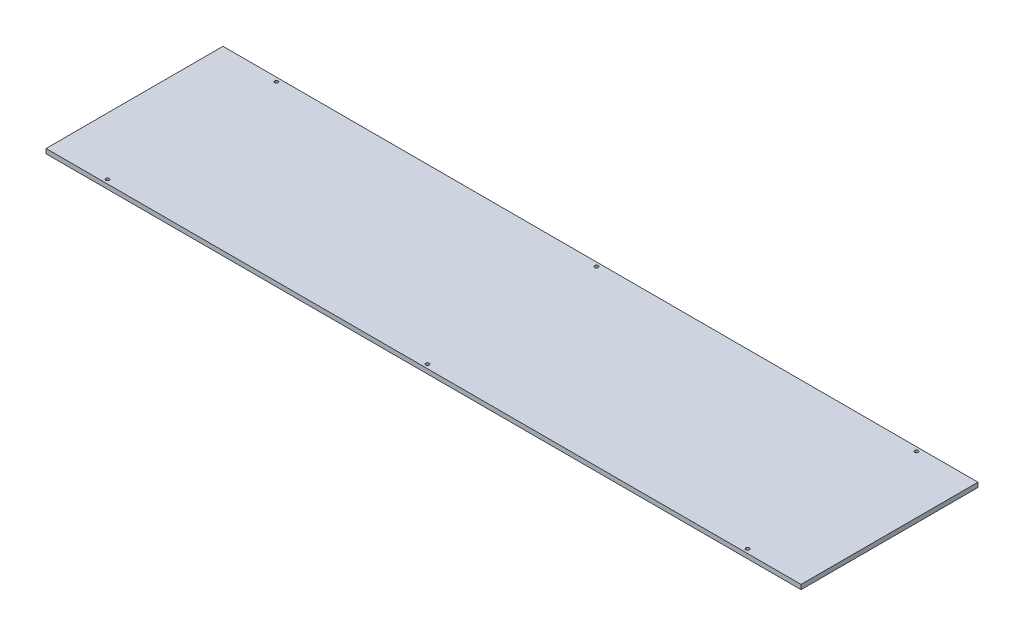
ISO-10303-21;
HEADER;
FILE_DESCRIPTION(('STEP AP214'),'2;1');
FILE_NAME('part.step','',(''),(''),'','','');
FILE_SCHEMA(('AUTOMOTIVE_DESIGN { 1 0 10303 214 1 1 1 1 }'));
ENDSEC;
DATA;
#1=APPLICATION_CONTEXT('core data for automotive mechanical design processes');
#2=APPLICATION_PROTOCOL_DEFINITION('international standard','automotive_design',2000,#1);
#3=PRODUCT_CONTEXT('',#1,'mechanical');
#4=PRODUCT('Part','Part','',(#3));
#5=PRODUCT_RELATED_PRODUCT_CATEGORY('part','',(#4));
#6=PRODUCT_DEFINITION_FORMATION('','',#4);
#7=PRODUCT_DEFINITION_CONTEXT('part definition',#1,'design');
#8=PRODUCT_DEFINITION('design','',#6,#7);
#9=PRODUCT_DEFINITION_SHAPE('','',#8);
#10=(LENGTH_UNIT() NAMED_UNIT(*) SI_UNIT(.MILLI.,.METRE.));
#11=(NAMED_UNIT(*) PLANE_ANGLE_UNIT() SI_UNIT($,.RADIAN.));
#12=(NAMED_UNIT(*) SI_UNIT($,.STERADIAN.) SOLID_ANGLE_UNIT());
#13=UNCERTAINTY_MEASURE_WITH_UNIT(LENGTH_MEASURE(1.E-05),#10,'distance_accuracy_value','');
#14=(GEOMETRIC_REPRESENTATION_CONTEXT(3) GLOBAL_UNCERTAINTY_ASSIGNED_CONTEXT((#13)) GLOBAL_UNIT_ASSIGNED_CONTEXT((#10,
#11,#12)) REPRESENTATION_CONTEXT('',''));
#15=CARTESIAN_POINT('',(0.,0.,0.));
#16=DIRECTION('',(0.,0.,1.));
#17=DIRECTION('',(1.,0.,0.));
#18=AXIS2_PLACEMENT_3D('',#15,#16,#17);
#19=CARTESIAN_POINT('',(0.,4.,0.));
#20=DIRECTION('',(0.,-1.,0.));
#21=DIRECTION('',(0.,0.,-1.));
#22=AXIS2_PLACEMENT_3D('',#19,#20,#21);
#23=PLANE('',#22);
#24=DIRECTION('',(0.,0.,1.));
#25=VECTOR('',#24,1.);
#26=CARTESIAN_POINT('',(-306.746461538461,4.,74.1935384615384));
#27=LINE('',#26,#25);
#28=CARTESIAN_POINT('',(-306.746461538461,4.,-79.8064615384616));
#29=VERTEX_POINT('',#28);
#30=CARTESIAN_POINT('',(-306.746461538461,4.,74.1935384615384));
#31=VERTEX_POINT('',#30);
#32=EDGE_CURVE('E89',#29,#31,#27,.T.);
#33=ORIENTED_EDGE('',*,*,#32,.T.);
#34=DIRECTION('',(1.,0.,0.));
#35=VECTOR('',#34,1.);
#36=CARTESIAN_POINT('',(-306.746461538461,4.,74.1935384615384));
#37=LINE('',#36,#35);
#38=CARTESIAN_POINT('',(350.253538461539,4.,74.1935384615384));
#39=VERTEX_POINT('',#38);
#40=EDGE_CURVE('E84',#31,#39,#37,.T.);
#41=ORIENTED_EDGE('',*,*,#40,.T.);
#42=DIRECTION('',(0.,0.,-1.));
#43=VECTOR('',#42,1.);
#44=CARTESIAN_POINT('',(350.253538461539,4.,74.1935384615384));
#45=LINE('',#44,#43);
#46=CARTESIAN_POINT('',(350.253538461539,4.,-79.8064615384616));
#47=VERTEX_POINT('',#46);
#48=EDGE_CURVE('E87',#39,#47,#45,.T.);
#49=ORIENTED_EDGE('',*,*,#48,.T.);
#50=DIRECTION('',(-1.,0.,0.));
#51=VECTOR('',#50,1.);
#52=CARTESIAN_POINT('',(-306.746461538461,4.,-79.8064615384616));
#53=LINE('',#52,#51);
#54=EDGE_CURVE('E54',#47,#29,#53,.T.);
#55=ORIENTED_EDGE('',*,*,#54,.T.);
#56=EDGE_LOOP('',(#33,#41,#49,#55));
#57=FACE_BOUND('',#56,.T.);
#58=CARTESIAN_POINT('',(-256.746461538461,4.,-76.3064615384616));
#59=DIRECTION('',(0.,1.,0.));
#60=DIRECTION('',(0.,0.,1.));
#61=AXIS2_PLACEMENT_3D('',#58,#59,#60);
#62=CIRCLE('',#61,1.50000000000002);
#63=CARTESIAN_POINT('',(-256.746461538461,4.,-74.8064615384615));
#64=VERTEX_POINT('',#63);
#65=EDGE_CURVE('E104',#64,#64,#62,.T.);
#66=ORIENTED_EDGE('',*,*,#65,.F.);
#67=EDGE_LOOP('',(#66));
#68=FACE_BOUND('',#67,.T.);
#69=CARTESIAN_POINT('',(21.7535384615387,4.,-76.3064615384616));
#70=DIRECTION('',(0.,1.,0.));
#71=DIRECTION('',(0.,0.,1.));
#72=AXIS2_PLACEMENT_3D('',#69,#70,#71);
#73=CIRCLE('',#72,1.5);
#74=CARTESIAN_POINT('',(21.7535384615387,4.,-74.8064615384616));
#75=VERTEX_POINT('',#74);
#76=EDGE_CURVE('E119',#75,#75,#73,.T.);
#77=ORIENTED_EDGE('',*,*,#76,.F.);
#78=EDGE_LOOP('',(#77));
#79=FACE_BOUND('',#78,.T.);
#80=CARTESIAN_POINT('',(300.253538461539,4.,-76.3064615384616));
#81=DIRECTION('',(0.,1.,0.));
#82=DIRECTION('',(0.,0.,1.));
#83=AXIS2_PLACEMENT_3D('',#80,#81,#82);
#84=CIRCLE('',#83,1.50000000000002);
#85=CARTESIAN_POINT('',(300.253538461539,4.,-74.8064615384615));
#86=VERTEX_POINT('',#85);
#87=EDGE_CURVE('E125',#86,#86,#84,.T.);
#88=ORIENTED_EDGE('',*,*,#87,.F.);
#89=EDGE_LOOP('',(#88));
#90=FACE_BOUND('',#89,.T.);
#91=CARTESIAN_POINT('',(300.253538461539,4.,70.6935384615384));
#92=DIRECTION('',(0.,1.,0.));
#93=DIRECTION('',(0.,0.,1.));
#94=AXIS2_PLACEMENT_3D('',#91,#92,#93);
#95=CIRCLE('',#94,1.50000000000002);
#96=CARTESIAN_POINT('',(300.253538461539,4.,72.1935384615385));
#97=VERTEX_POINT('',#96);
#98=EDGE_CURVE('E131',#97,#97,#95,.T.);
#99=ORIENTED_EDGE('',*,*,#98,.F.);
#100=EDGE_LOOP('',(#99));
#101=FACE_BOUND('',#100,.T.);
#102=CARTESIAN_POINT('',(21.7535384615387,4.,70.6935384615384));
#103=DIRECTION('',(0.,1.,0.));
#104=DIRECTION('',(0.,0.,1.));
#105=AXIS2_PLACEMENT_3D('',#102,#103,#104);
#106=CIRCLE('',#105,1.5);
#107=CARTESIAN_POINT('',(21.7535384615387,4.,72.1935384615384));
#108=VERTEX_POINT('',#107);
#109=EDGE_CURVE('E137',#108,#108,#106,.T.);
#110=ORIENTED_EDGE('',*,*,#109,.F.);
#111=EDGE_LOOP('',(#110));
#112=FACE_BOUND('',#111,.T.);
#113=CARTESIAN_POINT('',(-256.746461538461,4.,70.6935384615384));
#114=DIRECTION('',(0.,1.,0.));
#115=DIRECTION('',(0.,0.,1.));
#116=AXIS2_PLACEMENT_3D('',#113,#114,#115);
#117=CIRCLE('',#116,1.50000000000002);
#118=CARTESIAN_POINT('',(-256.746461538461,4.,72.1935384615385));
#119=VERTEX_POINT('',#118);
#120=EDGE_CURVE('E143',#119,#119,#117,.T.);
#121=ORIENTED_EDGE('',*,*,#120,.F.);
#122=EDGE_LOOP('',(#121));
#123=FACE_BOUND('',#122,.T.);
#124=ADVANCED_FACE('F37',(#57,#68,#79,#90,#101,#112,#123),#23,.F.);
#125=CARTESIAN_POINT('',(0.,0.,0.));
#126=DIRECTION('',(0.,-1.,0.));
#127=DIRECTION('',(0.,0.,-1.));
#128=AXIS2_PLACEMENT_3D('',#125,#126,#127);
#129=PLANE('',#128);
#130=CARTESIAN_POINT('',(21.7535384615387,0.,70.6935384615384));
#131=DIRECTION('',(0.,1.,0.));
#132=DIRECTION('',(0.,0.,1.));
#133=AXIS2_PLACEMENT_3D('',#130,#131,#132);
#134=CIRCLE('',#133,1.5);
#135=CARTESIAN_POINT('',(21.7535384615387,0.,72.1935384615384));
#136=VERTEX_POINT('',#135);
#137=EDGE_CURVE('E140',#136,#136,#134,.T.);
#138=ORIENTED_EDGE('',*,*,#137,.T.);
#139=EDGE_LOOP('',(#138));
#140=FACE_BOUND('',#139,.T.);
#141=CARTESIAN_POINT('',(300.253538461539,0.,-76.3064615384616));
#142=DIRECTION('',(0.,1.,0.));
#143=DIRECTION('',(0.,0.,1.));
#144=AXIS2_PLACEMENT_3D('',#141,#142,#143);
#145=CIRCLE('',#144,1.50000000000002);
#146=CARTESIAN_POINT('',(300.253538461539,0.,-74.8064615384615));
#147=VERTEX_POINT('',#146);
#148=EDGE_CURVE('E128',#147,#147,#145,.T.);
#149=ORIENTED_EDGE('',*,*,#148,.T.);
#150=EDGE_LOOP('',(#149));
#151=FACE_BOUND('',#150,.T.);
#152=CARTESIAN_POINT('',(-256.746461538461,0.,-76.3064615384616));
#153=DIRECTION('',(0.,1.,0.));
#154=DIRECTION('',(0.,0.,1.));
#155=AXIS2_PLACEMENT_3D('',#152,#153,#154);
#156=CIRCLE('',#155,1.50000000000002);
#157=CARTESIAN_POINT('',(-256.746461538461,0.,-74.8064615384615));
#158=VERTEX_POINT('',#157);
#159=EDGE_CURVE('E116',#158,#158,#156,.T.);
#160=ORIENTED_EDGE('',*,*,#159,.T.);
#161=EDGE_LOOP('',(#160));
#162=FACE_BOUND('',#161,.T.);
#163=DIRECTION('',(0.,0.,1.));
#164=VECTOR('',#163,1.);
#165=CARTESIAN_POINT('',(-306.746461538461,0.,74.1935384615384));
#166=LINE('',#165,#164);
#167=CARTESIAN_POINT('',(-306.746461538461,0.,-79.8064615384616));
#168=VERTEX_POINT('',#167);
#169=CARTESIAN_POINT('',(-306.746461538461,0.,74.1935384615384));
#170=VERTEX_POINT('',#169);
#171=EDGE_CURVE('E101',#168,#170,#166,.T.);
#172=ORIENTED_EDGE('',*,*,#171,.F.);
#173=DIRECTION('',(-1.,0.,0.));
#174=VECTOR('',#173,1.);
#175=CARTESIAN_POINT('',(-306.746461538461,0.,-79.8064615384616));
#176=LINE('',#175,#174);
#177=CARTESIAN_POINT('',(350.253538461539,0.,-79.8064615384616));
#178=VERTEX_POINT('',#177);
#179=EDGE_CURVE('E77',#178,#168,#176,.T.);
#180=ORIENTED_EDGE('',*,*,#179,.F.);
#181=DIRECTION('',(0.,0.,-1.));
#182=VECTOR('',#181,1.);
#183=CARTESIAN_POINT('',(350.253538461539,0.,74.1935384615384));
#184=LINE('',#183,#182);
#185=CARTESIAN_POINT('',(350.253538461539,0.,74.1935384615384));
#186=VERTEX_POINT('',#185);
#187=EDGE_CURVE('E71',#186,#178,#184,.T.);
#188=ORIENTED_EDGE('',*,*,#187,.F.);
#189=DIRECTION('',(1.,0.,0.));
#190=VECTOR('',#189,1.);
#191=CARTESIAN_POINT('',(-306.746461538461,0.,74.1935384615384));
#192=LINE('',#191,#190);
#193=EDGE_CURVE('E93',#170,#186,#192,.T.);
#194=ORIENTED_EDGE('',*,*,#193,.F.);
#195=EDGE_LOOP('',(#172,#180,#188,#194));
#196=FACE_BOUND('',#195,.T.);
#197=CARTESIAN_POINT('',(21.7535384615387,0.,-76.3064615384616));
#198=DIRECTION('',(0.,1.,0.));
#199=DIRECTION('',(0.,0.,1.));
#200=AXIS2_PLACEMENT_3D('',#197,#198,#199);
#201=CIRCLE('',#200,1.5);
#202=CARTESIAN_POINT('',(21.7535384615387,0.,-74.8064615384616));
#203=VERTEX_POINT('',#202);
#204=EDGE_CURVE('E122',#203,#203,#201,.T.);
#205=ORIENTED_EDGE('',*,*,#204,.T.);
#206=EDGE_LOOP('',(#205));
#207=FACE_BOUND('',#206,.T.);
#208=CARTESIAN_POINT('',(300.253538461539,0.,70.6935384615384));
#209=DIRECTION('',(0.,1.,0.));
#210=DIRECTION('',(0.,0.,1.));
#211=AXIS2_PLACEMENT_3D('',#208,#209,#210);
#212=CIRCLE('',#211,1.50000000000002);
#213=CARTESIAN_POINT('',(300.253538461539,0.,72.1935384615385));
#214=VERTEX_POINT('',#213);
#215=EDGE_CURVE('E134',#214,#214,#212,.T.);
#216=ORIENTED_EDGE('',*,*,#215,.T.);
#217=EDGE_LOOP('',(#216));
#218=FACE_BOUND('',#217,.T.);
#219=CARTESIAN_POINT('',(-256.746461538461,0.,70.6935384615384));
#220=DIRECTION('',(0.,1.,0.));
#221=DIRECTION('',(0.,0.,1.));
#222=AXIS2_PLACEMENT_3D('',#219,#220,#221);
#223=CIRCLE('',#222,1.50000000000002);
#224=CARTESIAN_POINT('',(-256.746461538461,0.,72.1935384615385));
#225=VERTEX_POINT('',#224);
#226=EDGE_CURVE('E146',#225,#225,#223,.T.);
#227=ORIENTED_EDGE('',*,*,#226,.T.);
#228=EDGE_LOOP('',(#227));
#229=FACE_BOUND('',#228,.T.);
#230=ADVANCED_FACE('F112',(#140,#151,#162,#196,#207,#218,#229),#129,.T.);
#231=CARTESIAN_POINT('',(-306.746461538461,4.,74.1935384615384));
#232=DIRECTION('',(1.,0.,0.));
#233=DIRECTION('',(0.,0.,-1.));
#234=AXIS2_PLACEMENT_3D('',#231,#232,#233);
#235=PLANE('',#234);
#236=ORIENTED_EDGE('',*,*,#171,.T.);
#237=DIRECTION('',(0.,-1.,0.));
#238=VECTOR('',#237,1.);
#239=CARTESIAN_POINT('',(-306.746461538461,4.,74.1935384615384));
#240=LINE('',#239,#238);
#241=EDGE_CURVE('E11',#31,#170,#240,.T.);
#242=ORIENTED_EDGE('',*,*,#241,.F.);
#243=ORIENTED_EDGE('',*,*,#32,.F.);
#244=DIRECTION('',(0.,-1.,0.));
#245=VECTOR('',#244,1.);
#246=CARTESIAN_POINT('',(-306.746461538461,4.,-79.8064615384616));
#247=LINE('',#246,#245);
#248=EDGE_CURVE('E97',#29,#168,#247,.T.);
#249=ORIENTED_EDGE('',*,*,#248,.T.);
#250=EDGE_LOOP('',(#236,#242,#243,#249));
#251=FACE_BOUND('',#250,.T.);
#252=ADVANCED_FACE('F39',(#251),#235,.F.);
#253=CARTESIAN_POINT('',(-306.746461538461,4.,74.1935384615384));
#254=DIRECTION('',(0.,0.,-1.));
#255=DIRECTION('',(-1.,0.,0.));
#256=AXIS2_PLACEMENT_3D('',#253,#254,#255);
#257=PLANE('',#256);
#258=ORIENTED_EDGE('',*,*,#193,.T.);
#259=DIRECTION('',(0.,-1.,0.));
#260=VECTOR('',#259,1.);
#261=CARTESIAN_POINT('',(350.253538461539,4.,74.1935384615384));
#262=LINE('',#261,#260);
#263=EDGE_CURVE('E46',#39,#186,#262,.T.);
#264=ORIENTED_EDGE('',*,*,#263,.F.);
#265=ORIENTED_EDGE('',*,*,#40,.F.);
#266=ORIENTED_EDGE('',*,*,#241,.T.);
#267=EDGE_LOOP('',(#258,#264,#265,#266));
#268=FACE_BOUND('',#267,.T.);
#269=ADVANCED_FACE('F92',(#268),#257,.F.);
#270=CARTESIAN_POINT('',(350.253538461539,4.,74.1935384615384));
#271=DIRECTION('',(-1.,0.,0.));
#272=DIRECTION('',(0.,0.,1.));
#273=AXIS2_PLACEMENT_3D('',#270,#271,#272);
#274=PLANE('',#273);
#275=ORIENTED_EDGE('',*,*,#187,.T.);
#276=DIRECTION('',(0.,-1.,0.));
#277=VECTOR('',#276,1.);
#278=CARTESIAN_POINT('',(350.253538461539,4.,-79.8064615384616));
#279=LINE('',#278,#277);
#280=EDGE_CURVE('E94',#47,#178,#279,.T.);
#281=ORIENTED_EDGE('',*,*,#280,.F.);
#282=ORIENTED_EDGE('',*,*,#48,.F.);
#283=ORIENTED_EDGE('',*,*,#263,.T.);
#284=EDGE_LOOP('',(#275,#281,#282,#283));
#285=FACE_BOUND('',#284,.T.);
#286=ADVANCED_FACE('F95',(#285),#274,.F.);
#287=CARTESIAN_POINT('',(-306.746461538461,4.,-79.8064615384616));
#288=DIRECTION('',(0.,0.,1.));
#289=DIRECTION('',(1.,0.,0.));
#290=AXIS2_PLACEMENT_3D('',#287,#288,#289);
#291=PLANE('',#290);
#292=ORIENTED_EDGE('',*,*,#179,.T.);
#293=ORIENTED_EDGE('',*,*,#248,.F.);
#294=ORIENTED_EDGE('',*,*,#54,.F.);
#295=ORIENTED_EDGE('',*,*,#280,.T.);
#296=EDGE_LOOP('',(#292,#293,#294,#295));
#297=FACE_BOUND('',#296,.T.);
#298=ADVANCED_FACE('F109',(#297),#291,.F.);
#299=CARTESIAN_POINT('',(-256.746461538461,4.,-76.3064615384616));
#300=DIRECTION('',(0.,-1.,0.));
#301=DIRECTION('',(0.,0.,-1.));
#302=AXIS2_PLACEMENT_3D('',#299,#300,#301);
#303=CYLINDRICAL_SURFACE('',#302,1.50000000000002);
#304=ORIENTED_EDGE('',*,*,#65,.T.);
#305=EDGE_LOOP('',(#304));
#306=FACE_BOUND('',#305,.T.);
#307=ORIENTED_EDGE('',*,*,#159,.F.);
#308=EDGE_LOOP('',(#307));
#309=FACE_BOUND('',#308,.T.);
#310=ADVANCED_FACE('F163',(#306,#309),#303,.F.);
#311=CARTESIAN_POINT('',(21.7535384615387,4.,-76.3064615384616));
#312=DIRECTION('',(0.,-1.,0.));
#313=DIRECTION('',(0.,0.,-1.));
#314=AXIS2_PLACEMENT_3D('',#311,#312,#313);
#315=CYLINDRICAL_SURFACE('',#314,1.5);
#316=ORIENTED_EDGE('',*,*,#76,.T.);
#317=EDGE_LOOP('',(#316));
#318=FACE_BOUND('',#317,.T.);
#319=ORIENTED_EDGE('',*,*,#204,.F.);
#320=EDGE_LOOP('',(#319));
#321=FACE_BOUND('',#320,.T.);
#322=ADVANCED_FACE('F209',(#318,#321),#315,.F.);
#323=CARTESIAN_POINT('',(300.253538461539,4.,-76.3064615384616));
#324=DIRECTION('',(0.,-1.,0.));
#325=DIRECTION('',(0.,0.,-1.));
#326=AXIS2_PLACEMENT_3D('',#323,#324,#325);
#327=CYLINDRICAL_SURFACE('',#326,1.50000000000002);
#328=ORIENTED_EDGE('',*,*,#87,.T.);
#329=EDGE_LOOP('',(#328));
#330=FACE_BOUND('',#329,.T.);
#331=ORIENTED_EDGE('',*,*,#148,.F.);
#332=EDGE_LOOP('',(#331));
#333=FACE_BOUND('',#332,.T.);
#334=ADVANCED_FACE('F217',(#330,#333),#327,.F.);
#335=CARTESIAN_POINT('',(300.253538461539,4.,70.6935384615384));
#336=DIRECTION('',(0.,-1.,0.));
#337=DIRECTION('',(0.,0.,-1.));
#338=AXIS2_PLACEMENT_3D('',#335,#336,#337);
#339=CYLINDRICAL_SURFACE('',#338,1.50000000000002);
#340=ORIENTED_EDGE('',*,*,#98,.T.);
#341=EDGE_LOOP('',(#340));
#342=FACE_BOUND('',#341,.T.);
#343=ORIENTED_EDGE('',*,*,#215,.F.);
#344=EDGE_LOOP('',(#343));
#345=FACE_BOUND('',#344,.T.);
#346=ADVANCED_FACE('F225',(#342,#345),#339,.F.);
#347=CARTESIAN_POINT('',(21.7535384615387,4.,70.6935384615384));
#348=DIRECTION('',(0.,-1.,0.));
#349=DIRECTION('',(0.,0.,-1.));
#350=AXIS2_PLACEMENT_3D('',#347,#348,#349);
#351=CYLINDRICAL_SURFACE('',#350,1.5);
#352=ORIENTED_EDGE('',*,*,#109,.T.);
#353=EDGE_LOOP('',(#352));
#354=FACE_BOUND('',#353,.T.);
#355=ORIENTED_EDGE('',*,*,#137,.F.);
#356=EDGE_LOOP('',(#355));
#357=FACE_BOUND('',#356,.T.);
#358=ADVANCED_FACE('F234',(#354,#357),#351,.F.);
#359=CARTESIAN_POINT('',(-256.746461538461,4.,70.6935384615384));
#360=DIRECTION('',(0.,-1.,0.));
#361=DIRECTION('',(0.,0.,-1.));
#362=AXIS2_PLACEMENT_3D('',#359,#360,#361);
#363=CYLINDRICAL_SURFACE('',#362,1.50000000000002);
#364=ORIENTED_EDGE('',*,*,#120,.T.);
#365=EDGE_LOOP('',(#364));
#366=FACE_BOUND('',#365,.T.);
#367=ORIENTED_EDGE('',*,*,#226,.F.);
#368=EDGE_LOOP('',(#367));
#369=FACE_BOUND('',#368,.T.);
#370=ADVANCED_FACE('F152',(#366,#369),#363,.F.);
#371=CLOSED_SHELL('',(#124,#230,#252,#269,#286,#298,#310,#322,#334,#346,#358,#370));
#372=MANIFOLD_SOLID_BREP('B2',#371);
#373=ADVANCED_BREP_SHAPE_REPRESENTATION('',(#18,#372),#14);
#374=SHAPE_DEFINITION_REPRESENTATION(#9,#373);
ENDSEC;
END-ISO-10303-21;
